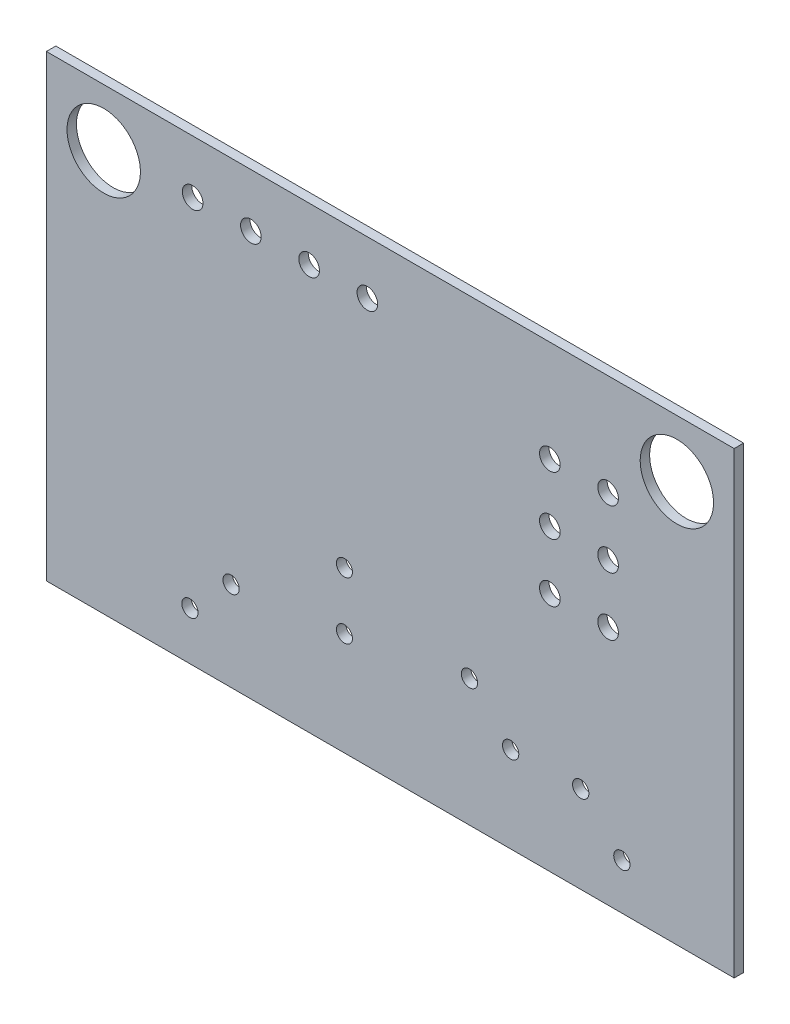
ISO-10303-21;
HEADER;
FILE_DESCRIPTION(('STEP AP214'),'2;1');
FILE_NAME('part.step','',(''),(''),'','','');
FILE_SCHEMA(('AUTOMOTIVE_DESIGN { 1 0 10303 214 1 1 1 1 }'));
ENDSEC;
DATA;
#1=APPLICATION_CONTEXT('core data for automotive mechanical design processes');
#2=APPLICATION_PROTOCOL_DEFINITION('international standard','automotive_design',2000,#1);
#3=PRODUCT_CONTEXT('',#1,'mechanical');
#4=PRODUCT('Part','Part','',(#3));
#5=PRODUCT_RELATED_PRODUCT_CATEGORY('part','',(#4));
#6=PRODUCT_DEFINITION_FORMATION('','',#4);
#7=PRODUCT_DEFINITION_CONTEXT('part definition',#1,'design');
#8=PRODUCT_DEFINITION('design','',#6,#7);
#9=PRODUCT_DEFINITION_SHAPE('','',#8);
#10=(LENGTH_UNIT() NAMED_UNIT(*) SI_UNIT(.MILLI.,.METRE.));
#11=(NAMED_UNIT(*) PLANE_ANGLE_UNIT() SI_UNIT($,.RADIAN.));
#12=(NAMED_UNIT(*) SI_UNIT($,.STERADIAN.) SOLID_ANGLE_UNIT());
#13=UNCERTAINTY_MEASURE_WITH_UNIT(LENGTH_MEASURE(1.E-05),#10,'distance_accuracy_value','');
#14=(GEOMETRIC_REPRESENTATION_CONTEXT(3) GLOBAL_UNCERTAINTY_ASSIGNED_CONTEXT((#13)) GLOBAL_UNIT_ASSIGNED_CONTEXT((#10,
#11,#12)) REPRESENTATION_CONTEXT('',''));
#15=CARTESIAN_POINT('',(0.,0.,0.));
#16=DIRECTION('',(0.,0.,1.));
#17=DIRECTION('',(1.,0.,0.));
#18=AXIS2_PLACEMENT_3D('',#15,#16,#17);
#19=CARTESIAN_POINT('',(0.,0.,0.41148));
#20=DIRECTION('',(0.,0.,1.));
#21=DIRECTION('',(1.,0.,0.));
#22=AXIS2_PLACEMENT_3D('',#19,#20,#21);
#23=PLANE('',#22);
#24=CARTESIAN_POINT('',(27.50000088,17.50000056,0.41148));
#25=DIRECTION('',(0.,0.,-1.));
#26=DIRECTION('',(-1.,0.,0.));
#27=AXIS2_PLACEMENT_3D('',#24,#25,#26);
#28=CIRCLE('',#27,1.59999934);
#29=CARTESIAN_POINT('',(25.90000154,17.50000056,0.41148));
#30=VERTEX_POINT('',#29);
#31=EDGE_CURVE('E140',#30,#30,#28,.T.);
#32=ORIENTED_EDGE('',*,*,#31,.T.);
#33=EDGE_LOOP('',(#32));
#34=FACE_BOUND('',#33,.T.);
#35=CARTESIAN_POINT('',(24.50000688,15.57999932,0.41148));
#36=DIRECTION('',(0.,0.,-1.));
#37=DIRECTION('',(-1.,0.,0.));
#38=AXIS2_PLACEMENT_3D('',#35,#36,#37);
#39=CIRCLE('',#38,0.4499991);
#40=CARTESIAN_POINT('',(24.05000778,15.57999932,0.41148));
#41=VERTEX_POINT('',#40);
#42=EDGE_CURVE('E143',#41,#41,#39,.T.);
#43=ORIENTED_EDGE('',*,*,#42,.T.);
#44=EDGE_LOOP('',(#43));
#45=FACE_BOUND('',#44,.T.);
#46=CARTESIAN_POINT('',(24.50000688,13.03999932,0.41148));
#47=DIRECTION('',(0.,0.,-1.));
#48=DIRECTION('',(-1.,0.,0.));
#49=AXIS2_PLACEMENT_3D('',#46,#47,#48);
#50=CIRCLE('',#49,0.4499991);
#51=CARTESIAN_POINT('',(24.05000778,13.03999932,0.41148));
#52=VERTEX_POINT('',#51);
#53=EDGE_CURVE('E146',#52,#52,#50,.T.);
#54=ORIENTED_EDGE('',*,*,#53,.T.);
#55=EDGE_LOOP('',(#54));
#56=FACE_BOUND('',#55,.T.);
#57=CARTESIAN_POINT('',(21.96000688,15.57999932,0.41148));
#58=DIRECTION('',(0.,0.,-1.));
#59=DIRECTION('',(-1.,0.,0.));
#60=AXIS2_PLACEMENT_3D('',#57,#58,#59);
#61=CIRCLE('',#60,0.4499991);
#62=CARTESIAN_POINT('',(21.51000778,15.57999932,0.41148));
#63=VERTEX_POINT('',#62);
#64=EDGE_CURVE('E149',#63,#63,#61,.T.);
#65=ORIENTED_EDGE('',*,*,#64,.T.);
#66=EDGE_LOOP('',(#65));
#67=FACE_BOUND('',#66,.T.);
#68=CARTESIAN_POINT('',(21.96000688,13.03999932,0.41148));
#69=DIRECTION('',(0.,0.,-1.));
#70=DIRECTION('',(-1.,0.,0.));
#71=AXIS2_PLACEMENT_3D('',#68,#69,#70);
#72=CIRCLE('',#71,0.4499991);
#73=CARTESIAN_POINT('',(21.51000778,13.03999932,0.41148));
#74=VERTEX_POINT('',#73);
#75=EDGE_CURVE('E152',#74,#74,#72,.T.);
#76=ORIENTED_EDGE('',*,*,#75,.T.);
#77=EDGE_LOOP('',(#76));
#78=FACE_BOUND('',#77,.T.);
#79=CARTESIAN_POINT('',(24.50000688,10.49999932,0.41148));
#80=DIRECTION('',(0.,0.,-1.));
#81=DIRECTION('',(-1.,0.,0.));
#82=AXIS2_PLACEMENT_3D('',#79,#80,#81);
#83=CIRCLE('',#82,0.4499991);
#84=CARTESIAN_POINT('',(24.05000778,10.49999932,0.41148));
#85=VERTEX_POINT('',#84);
#86=EDGE_CURVE('E155',#85,#85,#83,.T.);
#87=ORIENTED_EDGE('',*,*,#86,.T.);
#88=EDGE_LOOP('',(#87));
#89=FACE_BOUND('',#88,.T.);
#90=CARTESIAN_POINT('',(23.30588938,3.79605286,0.41148));
#91=DIRECTION('',(0.,0.,-1.));
#92=DIRECTION('',(-1.,0.,0.));
#93=AXIS2_PLACEMENT_3D('',#90,#91,#92);
#94=CIRCLE('',#93,0.3556);
#95=CARTESIAN_POINT('',(22.95028938,3.79605286,0.41148));
#96=VERTEX_POINT('',#95);
#97=EDGE_CURVE('E158',#96,#96,#94,.T.);
#98=ORIENTED_EDGE('',*,*,#97,.T.);
#99=EDGE_LOOP('',(#98));
#100=FACE_BOUND('',#99,.T.);
#101=CARTESIAN_POINT('',(25.10194116,2.00000108,0.41148));
#102=DIRECTION('',(0.,0.,-1.));
#103=DIRECTION('',(-1.,0.,0.));
#104=AXIS2_PLACEMENT_3D('',#101,#102,#103);
#105=CIRCLE('',#104,0.3556);
#106=CARTESIAN_POINT('',(24.74634116,2.00000108,0.41148));
#107=VERTEX_POINT('',#106);
#108=EDGE_CURVE('E161',#107,#107,#105,.T.);
#109=ORIENTED_EDGE('',*,*,#108,.T.);
#110=EDGE_LOOP('',(#109));
#111=FACE_BOUND('',#110,.T.);
#112=CARTESIAN_POINT('',(21.96000688,10.49999932,0.41148));
#113=DIRECTION('',(0.,0.,-1.));
#114=DIRECTION('',(-1.,0.,0.));
#115=AXIS2_PLACEMENT_3D('',#112,#113,#114);
#116=CIRCLE('',#115,0.4499991);
#117=CARTESIAN_POINT('',(21.51000778,10.49999932,0.41148));
#118=VERTEX_POINT('',#117);
#119=EDGE_CURVE('E164',#118,#118,#116,.T.);
#120=ORIENTED_EDGE('',*,*,#119,.T.);
#121=EDGE_LOOP('',(#120));
#122=FACE_BOUND('',#121,.T.);
#123=CARTESIAN_POINT('',(20.2499976,3.74999758,0.41148));
#124=DIRECTION('',(0.,0.,-1.));
#125=DIRECTION('',(-1.,0.,0.));
#126=AXIS2_PLACEMENT_3D('',#123,#124,#125);
#127=CIRCLE('',#126,0.3556);
#128=CARTESIAN_POINT('',(19.8943976,3.74999758,0.41148));
#129=VERTEX_POINT('',#128);
#130=EDGE_CURVE('E167',#129,#129,#127,.T.);
#131=ORIENTED_EDGE('',*,*,#130,.T.);
#132=EDGE_LOOP('',(#131));
#133=FACE_BOUND('',#132,.T.);
#134=CARTESIAN_POINT('',(11.45999994,17.67500148,0.41148));
#135=DIRECTION('',(0.,0.,-1.));
#136=DIRECTION('',(-1.,0.,0.));
#137=AXIS2_PLACEMENT_3D('',#134,#135,#136);
#138=CIRCLE('',#137,0.4499991);
#139=CARTESIAN_POINT('',(11.01000084,17.67500148,0.41148));
#140=VERTEX_POINT('',#139);
#141=EDGE_CURVE('E170',#140,#140,#138,.T.);
#142=ORIENTED_EDGE('',*,*,#141,.T.);
#143=EDGE_LOOP('',(#142));
#144=FACE_BOUND('',#143,.T.);
#145=CARTESIAN_POINT('',(8.91999994,17.67500148,0.41148));
#146=DIRECTION('',(0.,0.,-1.));
#147=DIRECTION('',(-1.,0.,0.));
#148=AXIS2_PLACEMENT_3D('',#145,#146,#147);
#149=CIRCLE('',#148,0.4499991);
#150=CARTESIAN_POINT('',(8.47000084,17.67500148,0.41148));
#151=VERTEX_POINT('',#150);
#152=EDGE_CURVE('E173',#151,#151,#149,.T.);
#153=ORIENTED_EDGE('',*,*,#152,.T.);
#154=EDGE_LOOP('',(#153));
#155=FACE_BOUND('',#154,.T.);
#156=CARTESIAN_POINT('',(13.99999994,17.67500148,0.41148));
#157=DIRECTION('',(0.,0.,-1.));
#158=DIRECTION('',(-1.,0.,0.));
#159=AXIS2_PLACEMENT_3D('',#156,#157,#158);
#160=CIRCLE('',#159,0.4499991);
#161=CARTESIAN_POINT('',(13.55000084,17.67500148,0.41148));
#162=VERTEX_POINT('',#161);
#163=EDGE_CURVE('E176',#162,#162,#160,.T.);
#164=ORIENTED_EDGE('',*,*,#163,.T.);
#165=EDGE_LOOP('',(#164));
#166=FACE_BOUND('',#165,.T.);
#167=CARTESIAN_POINT('',(2.50000008,17.50000056,0.41148));
#168=DIRECTION('',(0.,0.,-1.));
#169=DIRECTION('',(-1.,0.,0.));
#170=AXIS2_PLACEMENT_3D('',#167,#168,#169);
#171=CIRCLE('',#170,1.59999934);
#172=CARTESIAN_POINT('',(0.90000074,17.50000056,0.41148));
#173=VERTEX_POINT('',#172);
#174=EDGE_CURVE('E179',#173,#173,#171,.T.);
#175=ORIENTED_EDGE('',*,*,#174,.T.);
#176=EDGE_LOOP('',(#175));
#177=FACE_BOUND('',#176,.T.);
#178=CARTESIAN_POINT('',(6.37999994,17.67500148,0.41148));
#179=DIRECTION('',(0.,0.,-1.));
#180=DIRECTION('',(-1.,0.,0.));
#181=AXIS2_PLACEMENT_3D('',#178,#179,#180);
#182=CIRCLE('',#181,0.4499991);
#183=CARTESIAN_POINT('',(5.93000084,17.67500148,0.41148));
#184=VERTEX_POINT('',#183);
#185=EDGE_CURVE('E182',#184,#184,#182,.T.);
#186=ORIENTED_EDGE('',*,*,#185,.T.);
#187=EDGE_LOOP('',(#186));
#188=FACE_BOUND('',#187,.T.);
#189=CARTESIAN_POINT('',(18.45394582,5.54604936,0.41148));
#190=DIRECTION('',(0.,0.,-1.));
#191=DIRECTION('',(-1.,0.,0.));
#192=AXIS2_PLACEMENT_3D('',#189,#190,#191);
#193=CIRCLE('',#192,0.3556);
#194=CARTESIAN_POINT('',(18.09834582,5.54604936,0.41148));
#195=VERTEX_POINT('',#194);
#196=EDGE_CURVE('E185',#195,#195,#193,.T.);
#197=ORIENTED_EDGE('',*,*,#196,.T.);
#198=EDGE_LOOP('',(#197));
#199=FACE_BOUND('',#198,.T.);
#200=CARTESIAN_POINT('',(12.9999994,7.00000124,0.41148));
#201=DIRECTION('',(0.,0.,-1.));
#202=DIRECTION('',(-1.,0.,0.));
#203=AXIS2_PLACEMENT_3D('',#200,#201,#202);
#204=CIRCLE('',#203,0.3499993);
#205=CARTESIAN_POINT('',(12.6500001,7.00000124,0.41148));
#206=VERTEX_POINT('',#205);
#207=EDGE_CURVE('E188',#206,#206,#204,.T.);
#208=ORIENTED_EDGE('',*,*,#207,.T.);
#209=EDGE_LOOP('',(#208));
#210=FACE_BOUND('',#209,.T.);
#211=CARTESIAN_POINT('',(12.9999994,4.50000116,0.41148));
#212=DIRECTION('',(0.,0.,-1.));
#213=DIRECTION('',(-1.,0.,0.));
#214=AXIS2_PLACEMENT_3D('',#211,#212,#213);
#215=CIRCLE('',#214,0.3499993);
#216=CARTESIAN_POINT('',(12.6500001,4.50000116,0.41148));
#217=VERTEX_POINT('',#216);
#218=EDGE_CURVE('E191',#217,#217,#215,.T.);
#219=ORIENTED_EDGE('',*,*,#218,.T.);
#220=EDGE_LOOP('',(#219));
#221=FACE_BOUND('',#220,.T.);
#222=CARTESIAN_POINT('',(8.05591988,3.8980237,0.41148));
#223=DIRECTION('',(0.,0.,-1.));
#224=DIRECTION('',(-1.,0.,0.));
#225=AXIS2_PLACEMENT_3D('',#222,#223,#224);
#226=CIRCLE('',#225,0.3556);
#227=CARTESIAN_POINT('',(7.70031988,3.8980237,0.41148));
#228=VERTEX_POINT('',#227);
#229=EDGE_CURVE('E193',#228,#228,#226,.T.);
#230=ORIENTED_EDGE('',*,*,#229,.T.);
#231=EDGE_LOOP('',(#230));
#232=FACE_BOUND('',#231,.T.);
#233=CARTESIAN_POINT('',(6.2598681,2.10197446,0.41148));
#234=DIRECTION('',(0.,0.,-1.));
#235=DIRECTION('',(-1.,0.,0.));
#236=AXIS2_PLACEMENT_3D('',#233,#234,#235);
#237=CIRCLE('',#236,0.3556);
#238=CARTESIAN_POINT('',(5.9042681,2.10197446,0.41148));
#239=VERTEX_POINT('',#238);
#240=EDGE_CURVE('E20',#239,#239,#237,.T.);
#241=ORIENTED_EDGE('',*,*,#240,.T.);
#242=EDGE_LOOP('',(#241));
#243=FACE_BOUND('',#242,.T.);
#244=DIRECTION('',(1.,0.,0.));
#245=VECTOR('',#244,1.);
#246=CARTESIAN_POINT('',(0.,20.00000064,0.41148));
#247=LINE('',#246,#245);
#248=CARTESIAN_POINT('',(0.,20.00000064,0.41148));
#249=VERTEX_POINT('',#248);
#250=CARTESIAN_POINT('',(30.00000096,20.00000064,0.41148));
#251=VERTEX_POINT('',#250);
#252=EDGE_CURVE('E54',#249,#251,#247,.T.);
#253=ORIENTED_EDGE('',*,*,#252,.F.);
#254=DIRECTION('',(0.,1.,0.));
#255=VECTOR('',#254,1.);
#256=CARTESIAN_POINT('',(0.,0.,0.41148));
#257=LINE('',#256,#255);
#258=CARTESIAN_POINT('',(0.,0.,0.41148));
#259=VERTEX_POINT('',#258);
#260=EDGE_CURVE('E71',#259,#249,#257,.T.);
#261=ORIENTED_EDGE('',*,*,#260,.F.);
#262=DIRECTION('',(1.,0.,0.));
#263=VECTOR('',#262,1.);
#264=CARTESIAN_POINT('',(30.00000096,0.,0.41148));
#265=LINE('',#264,#263);
#266=CARTESIAN_POINT('',(30.00000096,0.,0.41148));
#267=VERTEX_POINT('',#266);
#268=EDGE_CURVE('E68',#267,#259,#265,.F.);
#269=ORIENTED_EDGE('',*,*,#268,.F.);
#270=DIRECTION('',(0.,1.,0.));
#271=VECTOR('',#270,1.);
#272=CARTESIAN_POINT('',(30.00000096,20.00000064,0.41148));
#273=LINE('',#272,#271);
#274=EDGE_CURVE('E59',#251,#267,#273,.F.);
#275=ORIENTED_EDGE('',*,*,#274,.F.);
#276=EDGE_LOOP('',(#253,#261,#269,#275));
#277=FACE_BOUND('',#276,.T.);
#278=ADVANCED_FACE('F17',(#34,#45,#56,#67,#78,#89,#100,#111,#122,#133,#144,#155,#166,#177,#188,
#199,#210,#221,#232,#243,#277),#23,.T.);
#279=CARTESIAN_POINT('',(30.00000096,0.,0.));
#280=DIRECTION('',(0.,-1.,0.));
#281=DIRECTION('',(0.,0.,-1.));
#282=AXIS2_PLACEMENT_3D('',#279,#280,#281);
#283=PLANE('',#282);
#284=DIRECTION('',(0.,0.,1.));
#285=VECTOR('',#284,1.);
#286=CARTESIAN_POINT('',(0.,0.,0.));
#287=LINE('',#286,#285);
#288=CARTESIAN_POINT('',(0.,0.,0.));
#289=VERTEX_POINT('',#288);
#290=EDGE_CURVE('E201',#289,#259,#287,.T.);
#291=ORIENTED_EDGE('',*,*,#290,.F.);
#292=DIRECTION('',(1.,0.,0.));
#293=VECTOR('',#292,1.);
#294=CARTESIAN_POINT('',(0.,0.,0.));
#295=LINE('',#294,#293);
#296=CARTESIAN_POINT('',(30.00000096,0.,0.));
#297=VERTEX_POINT('',#296);
#298=EDGE_CURVE('E78',#289,#297,#295,.T.);
#299=ORIENTED_EDGE('',*,*,#298,.T.);
#300=DIRECTION('',(0.,0.,-1.));
#301=VECTOR('',#300,1.);
#302=CARTESIAN_POINT('',(30.00000096,0.,0.));
#303=LINE('',#302,#301);
#304=EDGE_CURVE('E64',#267,#297,#303,.T.);
#305=ORIENTED_EDGE('',*,*,#304,.F.);
#306=ORIENTED_EDGE('',*,*,#268,.T.);
#307=EDGE_LOOP('',(#291,#299,#305,#306));
#308=FACE_BOUND('',#307,.T.);
#309=ADVANCED_FACE('F77',(#308),#283,.T.);
#310=CARTESIAN_POINT('',(30.00000096,20.00000064,0.));
#311=DIRECTION('',(1.,0.,0.));
#312=DIRECTION('',(0.,0.,-1.));
#313=AXIS2_PLACEMENT_3D('',#310,#311,#312);
#314=PLANE('',#313);
#315=ORIENTED_EDGE('',*,*,#304,.T.);
#316=DIRECTION('',(0.,1.,0.));
#317=VECTOR('',#316,1.);
#318=CARTESIAN_POINT('',(30.00000096,0.,0.));
#319=LINE('',#318,#317);
#320=CARTESIAN_POINT('',(30.00000096,20.00000064,0.));
#321=VERTEX_POINT('',#320);
#322=EDGE_CURVE('E212',#297,#321,#319,.T.);
#323=ORIENTED_EDGE('',*,*,#322,.T.);
#324=DIRECTION('',(0.,0.,1.));
#325=VECTOR('',#324,1.);
#326=CARTESIAN_POINT('',(30.00000096,20.00000064,0.));
#327=LINE('',#326,#325);
#328=EDGE_CURVE('E66',#251,#321,#327,.F.);
#329=ORIENTED_EDGE('',*,*,#328,.F.);
#330=ORIENTED_EDGE('',*,*,#274,.T.);
#331=EDGE_LOOP('',(#315,#323,#329,#330));
#332=FACE_BOUND('',#331,.T.);
#333=ADVANCED_FACE('F61',(#332),#314,.T.);
#334=CARTESIAN_POINT('',(0.,20.00000064,0.));
#335=DIRECTION('',(0.,1.,0.));
#336=DIRECTION('',(0.,0.,1.));
#337=AXIS2_PLACEMENT_3D('',#334,#335,#336);
#338=PLANE('',#337);
#339=ORIENTED_EDGE('',*,*,#328,.T.);
#340=DIRECTION('',(1.,0.,0.));
#341=VECTOR('',#340,1.);
#342=CARTESIAN_POINT('',(0.,20.00000064,0.));
#343=LINE('',#342,#341);
#344=CARTESIAN_POINT('',(0.,20.00000064,0.));
#345=VERTEX_POINT('',#344);
#346=EDGE_CURVE('E209',#321,#345,#343,.F.);
#347=ORIENTED_EDGE('',*,*,#346,.T.);
#348=DIRECTION('',(0.,0.,1.));
#349=VECTOR('',#348,1.);
#350=CARTESIAN_POINT('',(0.,20.00000064,0.));
#351=LINE('',#350,#349);
#352=EDGE_CURVE('E35',#249,#345,#351,.F.);
#353=ORIENTED_EDGE('',*,*,#352,.F.);
#354=ORIENTED_EDGE('',*,*,#252,.T.);
#355=EDGE_LOOP('',(#339,#347,#353,#354));
#356=FACE_BOUND('',#355,.T.);
#357=ADVANCED_FACE('F208',(#356),#338,.T.);
#358=CARTESIAN_POINT('',(0.,0.,0.));
#359=DIRECTION('',(-1.,0.,0.));
#360=DIRECTION('',(0.,0.,1.));
#361=AXIS2_PLACEMENT_3D('',#358,#359,#360);
#362=PLANE('',#361);
#363=ORIENTED_EDGE('',*,*,#352,.T.);
#364=DIRECTION('',(0.,1.,0.));
#365=VECTOR('',#364,1.);
#366=CARTESIAN_POINT('',(0.,0.,0.));
#367=LINE('',#366,#365);
#368=EDGE_CURVE('E139',#345,#289,#367,.F.);
#369=ORIENTED_EDGE('',*,*,#368,.T.);
#370=ORIENTED_EDGE('',*,*,#290,.T.);
#371=ORIENTED_EDGE('',*,*,#260,.T.);
#372=EDGE_LOOP('',(#363,#369,#370,#371));
#373=FACE_BOUND('',#372,.T.);
#374=ADVANCED_FACE('F215',(#373),#362,.T.);
#375=CARTESIAN_POINT('',(6.2598681,2.10197446,0.));
#376=DIRECTION('',(0.,0.,-1.));
#377=DIRECTION('',(-1.,0.,0.));
#378=AXIS2_PLACEMENT_3D('',#375,#376,#377);
#379=CYLINDRICAL_SURFACE('',#378,0.3556);
#380=ORIENTED_EDGE('',*,*,#240,.F.);
#381=EDGE_LOOP('',(#380));
#382=FACE_BOUND('',#381,.T.);
#383=CARTESIAN_POINT('',(6.2598681,2.10197446,0.));
#384=DIRECTION('',(0.,0.,-1.));
#385=DIRECTION('',(-1.,0.,0.));
#386=AXIS2_PLACEMENT_3D('',#383,#384,#385);
#387=CIRCLE('',#386,0.3556);
#388=CARTESIAN_POINT('',(5.9042681,2.10197446,0.));
#389=VERTEX_POINT('',#388);
#390=EDGE_CURVE('E136',#389,#389,#387,.T.);
#391=ORIENTED_EDGE('',*,*,#390,.T.);
#392=EDGE_LOOP('',(#391));
#393=FACE_BOUND('',#392,.T.);
#394=ADVANCED_FACE('F217',(#382,#393),#379,.F.);
#395=CARTESIAN_POINT('',(8.05591988,3.8980237,0.));
#396=DIRECTION('',(0.,0.,-1.));
#397=DIRECTION('',(-1.,0.,0.));
#398=AXIS2_PLACEMENT_3D('',#395,#396,#397);
#399=CYLINDRICAL_SURFACE('',#398,0.3556);
#400=ORIENTED_EDGE('',*,*,#229,.F.);
#401=EDGE_LOOP('',(#400));
#402=FACE_BOUND('',#401,.T.);
#403=CARTESIAN_POINT('',(8.05591988,3.8980237,0.));
#404=DIRECTION('',(0.,0.,-1.));
#405=DIRECTION('',(-1.,0.,0.));
#406=AXIS2_PLACEMENT_3D('',#403,#404,#405);
#407=CIRCLE('',#406,0.3556);
#408=CARTESIAN_POINT('',(7.70031988,3.8980237,0.));
#409=VERTEX_POINT('',#408);
#410=EDGE_CURVE('E133',#409,#409,#407,.T.);
#411=ORIENTED_EDGE('',*,*,#410,.T.);
#412=EDGE_LOOP('',(#411));
#413=FACE_BOUND('',#412,.T.);
#414=ADVANCED_FACE('F224',(#402,#413),#399,.F.);
#415=CARTESIAN_POINT('',(12.9999994,4.50000116,0.));
#416=DIRECTION('',(0.,0.,-1.));
#417=DIRECTION('',(-1.,0.,0.));
#418=AXIS2_PLACEMENT_3D('',#415,#416,#417);
#419=CYLINDRICAL_SURFACE('',#418,0.3499993);
#420=ORIENTED_EDGE('',*,*,#218,.F.);
#421=EDGE_LOOP('',(#420));
#422=FACE_BOUND('',#421,.T.);
#423=CARTESIAN_POINT('',(12.9999994,4.50000116,0.));
#424=DIRECTION('',(0.,0.,-1.));
#425=DIRECTION('',(-1.,0.,0.));
#426=AXIS2_PLACEMENT_3D('',#423,#424,#425);
#427=CIRCLE('',#426,0.3499993);
#428=CARTESIAN_POINT('',(12.6500001,4.50000116,0.));
#429=VERTEX_POINT('',#428);
#430=EDGE_CURVE('E130',#429,#429,#427,.T.);
#431=ORIENTED_EDGE('',*,*,#430,.T.);
#432=EDGE_LOOP('',(#431));
#433=FACE_BOUND('',#432,.T.);
#434=ADVANCED_FACE('F303',(#422,#433),#419,.F.);
#435=CARTESIAN_POINT('',(12.9999994,7.00000124,0.));
#436=DIRECTION('',(0.,0.,-1.));
#437=DIRECTION('',(-1.,0.,0.));
#438=AXIS2_PLACEMENT_3D('',#435,#436,#437);
#439=CYLINDRICAL_SURFACE('',#438,0.3499993);
#440=ORIENTED_EDGE('',*,*,#207,.F.);
#441=EDGE_LOOP('',(#440));
#442=FACE_BOUND('',#441,.T.);
#443=CARTESIAN_POINT('',(12.9999994,7.00000124,0.));
#444=DIRECTION('',(0.,0.,-1.));
#445=DIRECTION('',(-1.,0.,0.));
#446=AXIS2_PLACEMENT_3D('',#443,#444,#445);
#447=CIRCLE('',#446,0.3499993);
#448=CARTESIAN_POINT('',(12.6500001,7.00000124,0.));
#449=VERTEX_POINT('',#448);
#450=EDGE_CURVE('E127',#449,#449,#447,.T.);
#451=ORIENTED_EDGE('',*,*,#450,.T.);
#452=EDGE_LOOP('',(#451));
#453=FACE_BOUND('',#452,.T.);
#454=ADVANCED_FACE('F299',(#442,#453),#439,.F.);
#455=CARTESIAN_POINT('',(18.45394582,5.54604936,0.));
#456=DIRECTION('',(0.,0.,-1.));
#457=DIRECTION('',(-1.,0.,0.));
#458=AXIS2_PLACEMENT_3D('',#455,#456,#457);
#459=CYLINDRICAL_SURFACE('',#458,0.3556);
#460=ORIENTED_EDGE('',*,*,#196,.F.);
#461=EDGE_LOOP('',(#460));
#462=FACE_BOUND('',#461,.T.);
#463=CARTESIAN_POINT('',(18.45394582,5.54604936,0.));
#464=DIRECTION('',(0.,0.,-1.));
#465=DIRECTION('',(-1.,0.,0.));
#466=AXIS2_PLACEMENT_3D('',#463,#464,#465);
#467=CIRCLE('',#466,0.3556);
#468=CARTESIAN_POINT('',(18.09834582,5.54604936,0.));
#469=VERTEX_POINT('',#468);
#470=EDGE_CURVE('E124',#469,#469,#467,.T.);
#471=ORIENTED_EDGE('',*,*,#470,.T.);
#472=EDGE_LOOP('',(#471));
#473=FACE_BOUND('',#472,.T.);
#474=ADVANCED_FACE('F295',(#462,#473),#459,.F.);
#475=CARTESIAN_POINT('',(6.37999994,17.67500148,0.));
#476=DIRECTION('',(0.,0.,-1.));
#477=DIRECTION('',(-1.,0.,0.));
#478=AXIS2_PLACEMENT_3D('',#475,#476,#477);
#479=CYLINDRICAL_SURFACE('',#478,0.4499991);
#480=ORIENTED_EDGE('',*,*,#185,.F.);
#481=EDGE_LOOP('',(#480));
#482=FACE_BOUND('',#481,.T.);
#483=CARTESIAN_POINT('',(6.37999994,17.67500148,0.));
#484=DIRECTION('',(0.,0.,-1.));
#485=DIRECTION('',(-1.,0.,0.));
#486=AXIS2_PLACEMENT_3D('',#483,#484,#485);
#487=CIRCLE('',#486,0.4499991);
#488=CARTESIAN_POINT('',(5.93000084,17.67500148,0.));
#489=VERTEX_POINT('',#488);
#490=EDGE_CURVE('E121',#489,#489,#487,.T.);
#491=ORIENTED_EDGE('',*,*,#490,.T.);
#492=EDGE_LOOP('',(#491));
#493=FACE_BOUND('',#492,.T.);
#494=ADVANCED_FACE('F291',(#482,#493),#479,.F.);
#495=CARTESIAN_POINT('',(2.50000008,17.50000056,0.));
#496=DIRECTION('',(0.,0.,-1.));
#497=DIRECTION('',(-1.,0.,0.));
#498=AXIS2_PLACEMENT_3D('',#495,#496,#497);
#499=CYLINDRICAL_SURFACE('',#498,1.59999934);
#500=ORIENTED_EDGE('',*,*,#174,.F.);
#501=EDGE_LOOP('',(#500));
#502=FACE_BOUND('',#501,.T.);
#503=CARTESIAN_POINT('',(2.50000008,17.50000056,0.));
#504=DIRECTION('',(0.,0.,-1.));
#505=DIRECTION('',(-1.,0.,0.));
#506=AXIS2_PLACEMENT_3D('',#503,#504,#505);
#507=CIRCLE('',#506,1.59999934);
#508=CARTESIAN_POINT('',(0.90000074,17.50000056,0.));
#509=VERTEX_POINT('',#508);
#510=EDGE_CURVE('E118',#509,#509,#507,.T.);
#511=ORIENTED_EDGE('',*,*,#510,.T.);
#512=EDGE_LOOP('',(#511));
#513=FACE_BOUND('',#512,.T.);
#514=ADVANCED_FACE('F287',(#502,#513),#499,.F.);
#515=CARTESIAN_POINT('',(13.99999994,17.67500148,0.));
#516=DIRECTION('',(0.,0.,-1.));
#517=DIRECTION('',(-1.,0.,0.));
#518=AXIS2_PLACEMENT_3D('',#515,#516,#517);
#519=CYLINDRICAL_SURFACE('',#518,0.4499991);
#520=ORIENTED_EDGE('',*,*,#163,.F.);
#521=EDGE_LOOP('',(#520));
#522=FACE_BOUND('',#521,.T.);
#523=CARTESIAN_POINT('',(13.99999994,17.67500148,0.));
#524=DIRECTION('',(0.,0.,-1.));
#525=DIRECTION('',(-1.,0.,0.));
#526=AXIS2_PLACEMENT_3D('',#523,#524,#525);
#527=CIRCLE('',#526,0.4499991);
#528=CARTESIAN_POINT('',(13.55000084,17.67500148,0.));
#529=VERTEX_POINT('',#528);
#530=EDGE_CURVE('E115',#529,#529,#527,.T.);
#531=ORIENTED_EDGE('',*,*,#530,.T.);
#532=EDGE_LOOP('',(#531));
#533=FACE_BOUND('',#532,.T.);
#534=ADVANCED_FACE('F283',(#522,#533),#519,.F.);
#535=CARTESIAN_POINT('',(8.91999994,17.67500148,0.));
#536=DIRECTION('',(0.,0.,-1.));
#537=DIRECTION('',(-1.,0.,0.));
#538=AXIS2_PLACEMENT_3D('',#535,#536,#537);
#539=CYLINDRICAL_SURFACE('',#538,0.4499991);
#540=ORIENTED_EDGE('',*,*,#152,.F.);
#541=EDGE_LOOP('',(#540));
#542=FACE_BOUND('',#541,.T.);
#543=CARTESIAN_POINT('',(8.91999994,17.67500148,0.));
#544=DIRECTION('',(0.,0.,-1.));
#545=DIRECTION('',(-1.,0.,0.));
#546=AXIS2_PLACEMENT_3D('',#543,#544,#545);
#547=CIRCLE('',#546,0.4499991);
#548=CARTESIAN_POINT('',(8.47000084,17.67500148,0.));
#549=VERTEX_POINT('',#548);
#550=EDGE_CURVE('E112',#549,#549,#547,.T.);
#551=ORIENTED_EDGE('',*,*,#550,.T.);
#552=EDGE_LOOP('',(#551));
#553=FACE_BOUND('',#552,.T.);
#554=ADVANCED_FACE('F279',(#542,#553),#539,.F.);
#555=CARTESIAN_POINT('',(11.45999994,17.67500148,0.));
#556=DIRECTION('',(0.,0.,-1.));
#557=DIRECTION('',(-1.,0.,0.));
#558=AXIS2_PLACEMENT_3D('',#555,#556,#557);
#559=CYLINDRICAL_SURFACE('',#558,0.4499991);
#560=ORIENTED_EDGE('',*,*,#141,.F.);
#561=EDGE_LOOP('',(#560));
#562=FACE_BOUND('',#561,.T.);
#563=CARTESIAN_POINT('',(11.45999994,17.67500148,0.));
#564=DIRECTION('',(0.,0.,-1.));
#565=DIRECTION('',(-1.,0.,0.));
#566=AXIS2_PLACEMENT_3D('',#563,#564,#565);
#567=CIRCLE('',#566,0.4499991);
#568=CARTESIAN_POINT('',(11.01000084,17.67500148,0.));
#569=VERTEX_POINT('',#568);
#570=EDGE_CURVE('E109',#569,#569,#567,.T.);
#571=ORIENTED_EDGE('',*,*,#570,.T.);
#572=EDGE_LOOP('',(#571));
#573=FACE_BOUND('',#572,.T.);
#574=ADVANCED_FACE('F275',(#562,#573),#559,.F.);
#575=CARTESIAN_POINT('',(20.2499976,3.74999758,0.));
#576=DIRECTION('',(0.,0.,-1.));
#577=DIRECTION('',(-1.,0.,0.));
#578=AXIS2_PLACEMENT_3D('',#575,#576,#577);
#579=CYLINDRICAL_SURFACE('',#578,0.3556);
#580=ORIENTED_EDGE('',*,*,#130,.F.);
#581=EDGE_LOOP('',(#580));
#582=FACE_BOUND('',#581,.T.);
#583=CARTESIAN_POINT('',(20.2499976,3.74999758,0.));
#584=DIRECTION('',(0.,0.,-1.));
#585=DIRECTION('',(-1.,0.,0.));
#586=AXIS2_PLACEMENT_3D('',#583,#584,#585);
#587=CIRCLE('',#586,0.3556);
#588=CARTESIAN_POINT('',(19.8943976,3.74999758,0.));
#589=VERTEX_POINT('',#588);
#590=EDGE_CURVE('E106',#589,#589,#587,.T.);
#591=ORIENTED_EDGE('',*,*,#590,.T.);
#592=EDGE_LOOP('',(#591));
#593=FACE_BOUND('',#592,.T.);
#594=ADVANCED_FACE('F271',(#582,#593),#579,.F.);
#595=CARTESIAN_POINT('',(21.96000688,10.49999932,0.));
#596=DIRECTION('',(0.,0.,-1.));
#597=DIRECTION('',(-1.,0.,0.));
#598=AXIS2_PLACEMENT_3D('',#595,#596,#597);
#599=CYLINDRICAL_SURFACE('',#598,0.4499991);
#600=ORIENTED_EDGE('',*,*,#119,.F.);
#601=EDGE_LOOP('',(#600));
#602=FACE_BOUND('',#601,.T.);
#603=CARTESIAN_POINT('',(21.96000688,10.49999932,0.));
#604=DIRECTION('',(0.,0.,-1.));
#605=DIRECTION('',(-1.,0.,0.));
#606=AXIS2_PLACEMENT_3D('',#603,#604,#605);
#607=CIRCLE('',#606,0.4499991);
#608=CARTESIAN_POINT('',(21.51000778,10.49999932,0.));
#609=VERTEX_POINT('',#608);
#610=EDGE_CURVE('E103',#609,#609,#607,.T.);
#611=ORIENTED_EDGE('',*,*,#610,.T.);
#612=EDGE_LOOP('',(#611));
#613=FACE_BOUND('',#612,.T.);
#614=ADVANCED_FACE('F267',(#602,#613),#599,.F.);
#615=CARTESIAN_POINT('',(25.10194116,2.00000108,0.));
#616=DIRECTION('',(0.,0.,-1.));
#617=DIRECTION('',(-1.,0.,0.));
#618=AXIS2_PLACEMENT_3D('',#615,#616,#617);
#619=CYLINDRICAL_SURFACE('',#618,0.3556);
#620=ORIENTED_EDGE('',*,*,#108,.F.);
#621=EDGE_LOOP('',(#620));
#622=FACE_BOUND('',#621,.T.);
#623=CARTESIAN_POINT('',(25.10194116,2.00000108,0.));
#624=DIRECTION('',(0.,0.,-1.));
#625=DIRECTION('',(-1.,0.,0.));
#626=AXIS2_PLACEMENT_3D('',#623,#624,#625);
#627=CIRCLE('',#626,0.3556);
#628=CARTESIAN_POINT('',(24.74634116,2.00000108,0.));
#629=VERTEX_POINT('',#628);
#630=EDGE_CURVE('E100',#629,#629,#627,.T.);
#631=ORIENTED_EDGE('',*,*,#630,.T.);
#632=EDGE_LOOP('',(#631));
#633=FACE_BOUND('',#632,.T.);
#634=ADVANCED_FACE('F263',(#622,#633),#619,.F.);
#635=CARTESIAN_POINT('',(23.30588938,3.79605286,0.));
#636=DIRECTION('',(0.,0.,-1.));
#637=DIRECTION('',(-1.,0.,0.));
#638=AXIS2_PLACEMENT_3D('',#635,#636,#637);
#639=CYLINDRICAL_SURFACE('',#638,0.3556);
#640=ORIENTED_EDGE('',*,*,#97,.F.);
#641=EDGE_LOOP('',(#640));
#642=FACE_BOUND('',#641,.T.);
#643=CARTESIAN_POINT('',(23.30588938,3.79605286,0.));
#644=DIRECTION('',(0.,0.,-1.));
#645=DIRECTION('',(-1.,0.,0.));
#646=AXIS2_PLACEMENT_3D('',#643,#644,#645);
#647=CIRCLE('',#646,0.3556);
#648=CARTESIAN_POINT('',(22.95028938,3.79605286,0.));
#649=VERTEX_POINT('',#648);
#650=EDGE_CURVE('E97',#649,#649,#647,.T.);
#651=ORIENTED_EDGE('',*,*,#650,.T.);
#652=EDGE_LOOP('',(#651));
#653=FACE_BOUND('',#652,.T.);
#654=ADVANCED_FACE('F259',(#642,#653),#639,.F.);
#655=CARTESIAN_POINT('',(24.50000688,10.49999932,0.));
#656=DIRECTION('',(0.,0.,-1.));
#657=DIRECTION('',(-1.,0.,0.));
#658=AXIS2_PLACEMENT_3D('',#655,#656,#657);
#659=CYLINDRICAL_SURFACE('',#658,0.4499991);
#660=ORIENTED_EDGE('',*,*,#86,.F.);
#661=EDGE_LOOP('',(#660));
#662=FACE_BOUND('',#661,.T.);
#663=CARTESIAN_POINT('',(24.50000688,10.49999932,0.));
#664=DIRECTION('',(0.,0.,-1.));
#665=DIRECTION('',(-1.,0.,0.));
#666=AXIS2_PLACEMENT_3D('',#663,#664,#665);
#667=CIRCLE('',#666,0.4499991);
#668=CARTESIAN_POINT('',(24.05000778,10.49999932,0.));
#669=VERTEX_POINT('',#668);
#670=EDGE_CURVE('E94',#669,#669,#667,.T.);
#671=ORIENTED_EDGE('',*,*,#670,.T.);
#672=EDGE_LOOP('',(#671));
#673=FACE_BOUND('',#672,.T.);
#674=ADVANCED_FACE('F255',(#662,#673),#659,.F.);
#675=CARTESIAN_POINT('',(21.96000688,13.03999932,0.));
#676=DIRECTION('',(0.,0.,-1.));
#677=DIRECTION('',(-1.,0.,0.));
#678=AXIS2_PLACEMENT_3D('',#675,#676,#677);
#679=CYLINDRICAL_SURFACE('',#678,0.4499991);
#680=ORIENTED_EDGE('',*,*,#75,.F.);
#681=EDGE_LOOP('',(#680));
#682=FACE_BOUND('',#681,.T.);
#683=CARTESIAN_POINT('',(21.96000688,13.03999932,0.));
#684=DIRECTION('',(0.,0.,-1.));
#685=DIRECTION('',(-1.,0.,0.));
#686=AXIS2_PLACEMENT_3D('',#683,#684,#685);
#687=CIRCLE('',#686,0.4499991);
#688=CARTESIAN_POINT('',(21.51000778,13.03999932,0.));
#689=VERTEX_POINT('',#688);
#690=EDGE_CURVE('E91',#689,#689,#687,.T.);
#691=ORIENTED_EDGE('',*,*,#690,.T.);
#692=EDGE_LOOP('',(#691));
#693=FACE_BOUND('',#692,.T.);
#694=ADVANCED_FACE('F251',(#682,#693),#679,.F.);
#695=CARTESIAN_POINT('',(21.96000688,15.57999932,0.));
#696=DIRECTION('',(0.,0.,-1.));
#697=DIRECTION('',(-1.,0.,0.));
#698=AXIS2_PLACEMENT_3D('',#695,#696,#697);
#699=CYLINDRICAL_SURFACE('',#698,0.4499991);
#700=ORIENTED_EDGE('',*,*,#64,.F.);
#701=EDGE_LOOP('',(#700));
#702=FACE_BOUND('',#701,.T.);
#703=CARTESIAN_POINT('',(21.96000688,15.57999932,0.));
#704=DIRECTION('',(0.,0.,-1.));
#705=DIRECTION('',(-1.,0.,0.));
#706=AXIS2_PLACEMENT_3D('',#703,#704,#705);
#707=CIRCLE('',#706,0.4499991);
#708=CARTESIAN_POINT('',(21.51000778,15.57999932,0.));
#709=VERTEX_POINT('',#708);
#710=EDGE_CURVE('E88',#709,#709,#707,.T.);
#711=ORIENTED_EDGE('',*,*,#710,.T.);
#712=EDGE_LOOP('',(#711));
#713=FACE_BOUND('',#712,.T.);
#714=ADVANCED_FACE('F247',(#702,#713),#699,.F.);
#715=CARTESIAN_POINT('',(24.50000688,13.03999932,0.));
#716=DIRECTION('',(0.,0.,-1.));
#717=DIRECTION('',(-1.,0.,0.));
#718=AXIS2_PLACEMENT_3D('',#715,#716,#717);
#719=CYLINDRICAL_SURFACE('',#718,0.4499991);
#720=ORIENTED_EDGE('',*,*,#53,.F.);
#721=EDGE_LOOP('',(#720));
#722=FACE_BOUND('',#721,.T.);
#723=CARTESIAN_POINT('',(24.50000688,13.03999932,0.));
#724=DIRECTION('',(0.,0.,-1.));
#725=DIRECTION('',(-1.,0.,0.));
#726=AXIS2_PLACEMENT_3D('',#723,#724,#725);
#727=CIRCLE('',#726,0.4499991);
#728=CARTESIAN_POINT('',(24.05000778,13.03999932,0.));
#729=VERTEX_POINT('',#728);
#730=EDGE_CURVE('E85',#729,#729,#727,.T.);
#731=ORIENTED_EDGE('',*,*,#730,.T.);
#732=EDGE_LOOP('',(#731));
#733=FACE_BOUND('',#732,.T.);
#734=ADVANCED_FACE('F243',(#722,#733),#719,.F.);
#735=CARTESIAN_POINT('',(24.50000688,15.57999932,0.));
#736=DIRECTION('',(0.,0.,-1.));
#737=DIRECTION('',(-1.,0.,0.));
#738=AXIS2_PLACEMENT_3D('',#735,#736,#737);
#739=CYLINDRICAL_SURFACE('',#738,0.4499991);
#740=ORIENTED_EDGE('',*,*,#42,.F.);
#741=EDGE_LOOP('',(#740));
#742=FACE_BOUND('',#741,.T.);
#743=CARTESIAN_POINT('',(24.50000688,15.57999932,0.));
#744=DIRECTION('',(0.,0.,-1.));
#745=DIRECTION('',(-1.,0.,0.));
#746=AXIS2_PLACEMENT_3D('',#743,#744,#745);
#747=CIRCLE('',#746,0.4499991);
#748=CARTESIAN_POINT('',(24.05000778,15.57999932,0.));
#749=VERTEX_POINT('',#748);
#750=EDGE_CURVE('E26',#749,#749,#747,.T.);
#751=ORIENTED_EDGE('',*,*,#750,.T.);
#752=EDGE_LOOP('',(#751));
#753=FACE_BOUND('',#752,.T.);
#754=ADVANCED_FACE('F235',(#742,#753),#739,.F.);
#755=CARTESIAN_POINT('',(27.50000088,17.50000056,0.));
#756=DIRECTION('',(0.,0.,-1.));
#757=DIRECTION('',(-1.,0.,0.));
#758=AXIS2_PLACEMENT_3D('',#755,#756,#757);
#759=CYLINDRICAL_SURFACE('',#758,1.59999934);
#760=ORIENTED_EDGE('',*,*,#31,.F.);
#761=EDGE_LOOP('',(#760));
#762=FACE_BOUND('',#761,.T.);
#763=CARTESIAN_POINT('',(27.50000088,17.50000056,0.));
#764=DIRECTION('',(0.,0.,-1.));
#765=DIRECTION('',(-1.,0.,0.));
#766=AXIS2_PLACEMENT_3D('',#763,#764,#765);
#767=CIRCLE('',#766,1.59999934);
#768=CARTESIAN_POINT('',(25.90000154,17.50000056,0.));
#769=VERTEX_POINT('',#768);
#770=EDGE_CURVE('E11',#769,#769,#767,.T.);
#771=ORIENTED_EDGE('',*,*,#770,.T.);
#772=EDGE_LOOP('',(#771));
#773=FACE_BOUND('',#772,.T.);
#774=ADVANCED_FACE('F229',(#762,#773),#759,.F.);
#775=CARTESIAN_POINT('',(0.,0.,0.));
#776=DIRECTION('',(0.,0.,1.));
#777=DIRECTION('',(1.,0.,0.));
#778=AXIS2_PLACEMENT_3D('',#775,#776,#777);
#779=PLANE('',#778);
#780=ORIENTED_EDGE('',*,*,#770,.F.);
#781=EDGE_LOOP('',(#780));
#782=FACE_BOUND('',#781,.T.);
#783=ORIENTED_EDGE('',*,*,#750,.F.);
#784=EDGE_LOOP('',(#783));
#785=FACE_BOUND('',#784,.T.);
#786=ORIENTED_EDGE('',*,*,#730,.F.);
#787=EDGE_LOOP('',(#786));
#788=FACE_BOUND('',#787,.T.);
#789=ORIENTED_EDGE('',*,*,#710,.F.);
#790=EDGE_LOOP('',(#789));
#791=FACE_BOUND('',#790,.T.);
#792=ORIENTED_EDGE('',*,*,#690,.F.);
#793=EDGE_LOOP('',(#792));
#794=FACE_BOUND('',#793,.T.);
#795=ORIENTED_EDGE('',*,*,#670,.F.);
#796=EDGE_LOOP('',(#795));
#797=FACE_BOUND('',#796,.T.);
#798=ORIENTED_EDGE('',*,*,#650,.F.);
#799=EDGE_LOOP('',(#798));
#800=FACE_BOUND('',#799,.T.);
#801=ORIENTED_EDGE('',*,*,#630,.F.);
#802=EDGE_LOOP('',(#801));
#803=FACE_BOUND('',#802,.T.);
#804=ORIENTED_EDGE('',*,*,#610,.F.);
#805=EDGE_LOOP('',(#804));
#806=FACE_BOUND('',#805,.T.);
#807=ORIENTED_EDGE('',*,*,#590,.F.);
#808=EDGE_LOOP('',(#807));
#809=FACE_BOUND('',#808,.T.);
#810=ORIENTED_EDGE('',*,*,#570,.F.);
#811=EDGE_LOOP('',(#810));
#812=FACE_BOUND('',#811,.T.);
#813=ORIENTED_EDGE('',*,*,#550,.F.);
#814=EDGE_LOOP('',(#813));
#815=FACE_BOUND('',#814,.T.);
#816=ORIENTED_EDGE('',*,*,#530,.F.);
#817=EDGE_LOOP('',(#816));
#818=FACE_BOUND('',#817,.T.);
#819=ORIENTED_EDGE('',*,*,#510,.F.);
#820=EDGE_LOOP('',(#819));
#821=FACE_BOUND('',#820,.T.);
#822=ORIENTED_EDGE('',*,*,#490,.F.);
#823=EDGE_LOOP('',(#822));
#824=FACE_BOUND('',#823,.T.);
#825=ORIENTED_EDGE('',*,*,#470,.F.);
#826=EDGE_LOOP('',(#825));
#827=FACE_BOUND('',#826,.T.);
#828=ORIENTED_EDGE('',*,*,#450,.F.);
#829=EDGE_LOOP('',(#828));
#830=FACE_BOUND('',#829,.T.);
#831=ORIENTED_EDGE('',*,*,#430,.F.);
#832=EDGE_LOOP('',(#831));
#833=FACE_BOUND('',#832,.T.);
#834=ORIENTED_EDGE('',*,*,#410,.F.);
#835=EDGE_LOOP('',(#834));
#836=FACE_BOUND('',#835,.T.);
#837=ORIENTED_EDGE('',*,*,#390,.F.);
#838=EDGE_LOOP('',(#837));
#839=FACE_BOUND('',#838,.T.);
#840=ORIENTED_EDGE('',*,*,#346,.F.);
#841=ORIENTED_EDGE('',*,*,#322,.F.);
#842=ORIENTED_EDGE('',*,*,#298,.F.);
#843=ORIENTED_EDGE('',*,*,#368,.F.);
#844=EDGE_LOOP('',(#840,#841,#842,#843));
#845=FACE_BOUND('',#844,.T.);
#846=ADVANCED_FACE('F211',(#782,#785,#788,#791,#794,#797,#800,#803,#806,#809,#812,#815,#818,
#821,#824,#827,#830,#833,#836,#839,#845),#779,.F.);
#847=CLOSED_SHELL('',(#278,#309,#333,#357,#374,#394,#414,#434,#454,#474,#494,#514,#534,#554,
#574,#594,#614,#634,#654,#674,#694,#714,#734,#754,#774,#846));
#848=MANIFOLD_SOLID_BREP('B1',#847);
#849=ADVANCED_BREP_SHAPE_REPRESENTATION('',(#18,#848),#14);
#850=SHAPE_DEFINITION_REPRESENTATION(#9,#849);
ENDSEC;
END-ISO-10303-21;
